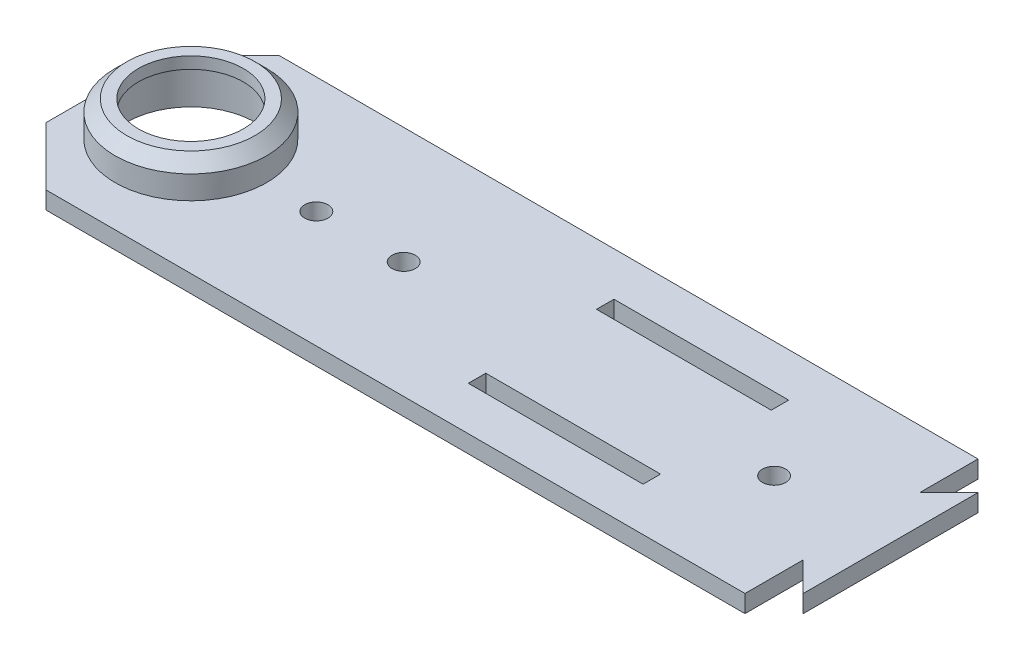
ISO-10303-21;
HEADER;
FILE_DESCRIPTION(('STEP AP214'),'2;1');
FILE_NAME('part.step','',(''),(''),'','','');
FILE_SCHEMA(('AUTOMOTIVE_DESIGN { 1 0 10303 214 1 1 1 1 }'));
ENDSEC;
DATA;
#1=APPLICATION_CONTEXT('core data for automotive mechanical design processes');
#2=APPLICATION_PROTOCOL_DEFINITION('international standard','automotive_design',2000,#1);
#3=PRODUCT_CONTEXT('',#1,'mechanical');
#4=PRODUCT('Part','Part','',(#3));
#5=PRODUCT_RELATED_PRODUCT_CATEGORY('part','',(#4));
#6=PRODUCT_DEFINITION_FORMATION('','',#4);
#7=PRODUCT_DEFINITION_CONTEXT('part definition',#1,'design');
#8=PRODUCT_DEFINITION('design','',#6,#7);
#9=PRODUCT_DEFINITION_SHAPE('','',#8);
#10=(LENGTH_UNIT() NAMED_UNIT(*) SI_UNIT(.MILLI.,.METRE.));
#11=(NAMED_UNIT(*) PLANE_ANGLE_UNIT() SI_UNIT($,.RADIAN.));
#12=(NAMED_UNIT(*) SI_UNIT($,.STERADIAN.) SOLID_ANGLE_UNIT());
#13=UNCERTAINTY_MEASURE_WITH_UNIT(LENGTH_MEASURE(1.E-05),#10,'distance_accuracy_value','');
#14=(GEOMETRIC_REPRESENTATION_CONTEXT(3) GLOBAL_UNCERTAINTY_ASSIGNED_CONTEXT((#13)) GLOBAL_UNIT_ASSIGNED_CONTEXT((#10,
#11,#12)) REPRESENTATION_CONTEXT('',''));
#15=CARTESIAN_POINT('',(0.,0.,0.));
#16=DIRECTION('',(0.,0.,1.));
#17=DIRECTION('',(1.,0.,0.));
#18=AXIS2_PLACEMENT_3D('',#15,#16,#17);
#19=CARTESIAN_POINT('',(0.,3.,0.));
#20=DIRECTION('',(0.,-1.,0.));
#21=DIRECTION('',(0.,0.,-1.));
#22=AXIS2_PLACEMENT_3D('',#19,#20,#21);
#23=PLANE('',#22);
#24=DIRECTION('',(0.,0.,-1.));
#25=VECTOR('',#24,1.);
#26=CARTESIAN_POINT('',(40.,3.,12.5));
#27=LINE('',#26,#25);
#28=CARTESIAN_POINT('',(40.,3.,12.5));
#29=VERTEX_POINT('',#28);
#30=CARTESIAN_POINT('',(40.,3.,9.5));
#31=VERTEX_POINT('',#30);
#32=EDGE_CURVE('E174',#29,#31,#27,.T.);
#33=ORIENTED_EDGE('',*,*,#32,.F.);
#34=DIRECTION('',(1.,0.,0.));
#35=VECTOR('',#34,1.);
#36=CARTESIAN_POINT('',(10.,3.,12.5));
#37=LINE('',#36,#35);
#38=CARTESIAN_POINT('',(10.,3.,12.5));
#39=VERTEX_POINT('',#38);
#40=EDGE_CURVE('E204',#39,#29,#37,.T.);
#41=ORIENTED_EDGE('',*,*,#40,.F.);
#42=DIRECTION('',(0.,0.,1.));
#43=VECTOR('',#42,1.);
#44=CARTESIAN_POINT('',(10.,3.,12.5));
#45=LINE('',#44,#43);
#46=CARTESIAN_POINT('',(10.,3.,9.5));
#47=VERTEX_POINT('',#46);
#48=EDGE_CURVE('E200',#47,#39,#45,.T.);
#49=ORIENTED_EDGE('',*,*,#48,.F.);
#50=DIRECTION('',(-1.,0.,0.));
#51=VECTOR('',#50,1.);
#52=CARTESIAN_POINT('',(10.,3.,9.5));
#53=LINE('',#52,#51);
#54=EDGE_CURVE('E185',#31,#47,#53,.T.);
#55=ORIENTED_EDGE('',*,*,#54,.F.);
#56=EDGE_LOOP('',(#33,#41,#49,#55));
#57=FACE_BOUND('',#56,.T.);
#58=DIRECTION('',(0.,0.,1.));
#59=VECTOR('',#58,1.);
#60=CARTESIAN_POINT('',(-65.,3.,20.));
#61=LINE('',#60,#59);
#62=CARTESIAN_POINT('',(-65.,3.,-9.99999999999997));
#63=VERTEX_POINT('',#62);
#64=CARTESIAN_POINT('',(-65.,3.,9.99999999999999));
#65=VERTEX_POINT('',#64);
#66=EDGE_CURVE('E309',#63,#65,#61,.T.);
#67=ORIENTED_EDGE('',*,*,#66,.T.);
#68=DIRECTION('',(-0.707106781186546,0.,-0.707106781186549));
#69=VECTOR('',#68,1.);
#70=CARTESIAN_POINT('',(-55.,3.,20.));
#71=LINE('',#70,#69);
#72=CARTESIAN_POINT('',(-55.,3.,20.));
#73=VERTEX_POINT('',#72);
#74=EDGE_CURVE('E55',#65,#73,#71,.F.);
#75=ORIENTED_EDGE('',*,*,#74,.T.);
#76=DIRECTION('',(1.,0.,0.));
#77=VECTOR('',#76,1.);
#78=CARTESIAN_POINT('',(-65.,3.,20.));
#79=LINE('',#78,#77);
#80=CARTESIAN_POINT('',(65.,3.,20.));
#81=VERTEX_POINT('',#80);
#82=EDGE_CURVE('E312',#73,#81,#79,.T.);
#83=ORIENTED_EDGE('',*,*,#82,.T.);
#84=DIRECTION('',(0.,0.,-1.));
#85=VECTOR('',#84,1.);
#86=CARTESIAN_POINT('',(65.,3.,20.));
#87=LINE('',#86,#85);
#88=CARTESIAN_POINT('',(65.,3.,10.));
#89=VERTEX_POINT('',#88);
#90=EDGE_CURVE('E315',#81,#89,#87,.T.);
#91=ORIENTED_EDGE('',*,*,#90,.T.);
#92=DIRECTION('',(0.70710678118655,0.,0.707106781186545));
#93=VECTOR('',#92,1.);
#94=CARTESIAN_POINT('',(70.,3.,15.));
#95=LINE('',#94,#93);
#96=CARTESIAN_POINT('',(70.,3.,15.));
#97=VERTEX_POINT('',#96);
#98=EDGE_CURVE('E318',#89,#97,#95,.T.);
#99=ORIENTED_EDGE('',*,*,#98,.T.);
#100=DIRECTION('',(0.,0.,-1.));
#101=VECTOR('',#100,1.);
#102=CARTESIAN_POINT('',(70.,3.,-15.));
#103=LINE('',#102,#101);
#104=CARTESIAN_POINT('',(70.,3.,-15.));
#105=VERTEX_POINT('',#104);
#106=EDGE_CURVE('E321',#97,#105,#103,.T.);
#107=ORIENTED_EDGE('',*,*,#106,.T.);
#108=DIRECTION('',(-0.707106781186549,0.,0.707106781186546));
#109=VECTOR('',#108,1.);
#110=CARTESIAN_POINT('',(65.,3.,-9.99999999999999));
#111=LINE('',#110,#109);
#112=CARTESIAN_POINT('',(65.,3.,-9.99999999999999));
#113=VERTEX_POINT('',#112);
#114=EDGE_CURVE('E324',#105,#113,#111,.T.);
#115=ORIENTED_EDGE('',*,*,#114,.T.);
#116=DIRECTION('',(0.,0.,-1.));
#117=VECTOR('',#116,1.);
#118=CARTESIAN_POINT('',(65.,3.,-9.99999999999999));
#119=LINE('',#118,#117);
#120=CARTESIAN_POINT('',(65.,3.,-20.));
#121=VERTEX_POINT('',#120);
#122=EDGE_CURVE('E301',#113,#121,#119,.T.);
#123=ORIENTED_EDGE('',*,*,#122,.T.);
#124=DIRECTION('',(-1.,0.,0.));
#125=VECTOR('',#124,1.);
#126=CARTESIAN_POINT('',(-65.,3.,-20.));
#127=LINE('',#126,#125);
#128=CARTESIAN_POINT('',(-54.9999999999999,3.,-20.));
#129=VERTEX_POINT('',#128);
#130=EDGE_CURVE('E305',#121,#129,#127,.T.);
#131=ORIENTED_EDGE('',*,*,#130,.T.);
#132=DIRECTION('',(0.707106781186549,0.,-0.707106781186546));
#133=VECTOR('',#132,1.);
#134=CARTESIAN_POINT('',(-65.,3.,-9.99999999999997));
#135=LINE('',#134,#133);
#136=EDGE_CURVE('E402',#129,#63,#135,.F.);
#137=ORIENTED_EDGE('',*,*,#136,.T.);
#138=EDGE_LOOP('',(#67,#75,#83,#91,#99,#107,#115,#123,#131,#137));
#139=FACE_BOUND('',#138,.T.);
#140=DIRECTION('',(0.,0.,-1.));
#141=VECTOR('',#140,1.);
#142=CARTESIAN_POINT('',(40.,3.,-9.5));
#143=LINE('',#142,#141);
#144=CARTESIAN_POINT('',(40.,3.,-9.5));
#145=VERTEX_POINT('',#144);
#146=CARTESIAN_POINT('',(40.,3.,-12.5));
#147=VERTEX_POINT('',#146);
#148=EDGE_CURVE('E254',#145,#147,#143,.T.);
#149=ORIENTED_EDGE('',*,*,#148,.F.);
#150=DIRECTION('',(1.,0.,0.));
#151=VECTOR('',#150,1.);
#152=CARTESIAN_POINT('',(10.,3.,-9.5));
#153=LINE('',#152,#151);
#154=CARTESIAN_POINT('',(10.,3.,-9.5));
#155=VERTEX_POINT('',#154);
#156=EDGE_CURVE('E265',#155,#145,#153,.T.);
#157=ORIENTED_EDGE('',*,*,#156,.F.);
#158=DIRECTION('',(0.,0.,1.));
#159=VECTOR('',#158,1.);
#160=CARTESIAN_POINT('',(10.,3.,-9.5));
#161=LINE('',#160,#159);
#162=CARTESIAN_POINT('',(10.,3.,-12.5));
#163=VERTEX_POINT('',#162);
#164=EDGE_CURVE('E261',#163,#155,#161,.T.);
#165=ORIENTED_EDGE('',*,*,#164,.F.);
#166=DIRECTION('',(-1.,0.,0.));
#167=VECTOR('',#166,1.);
#168=CARTESIAN_POINT('',(10.,3.,-12.5));
#169=LINE('',#168,#167);
#170=EDGE_CURVE('E257',#147,#163,#169,.T.);
#171=ORIENTED_EDGE('',*,*,#170,.F.);
#172=EDGE_LOOP('',(#149,#157,#165,#171));
#173=FACE_BOUND('',#172,.T.);
#174=CARTESIAN_POINT('',(-28.5951279086347,3.,0.));
#175=DIRECTION('',(0.,1.,0.));
#176=DIRECTION('',(0.,0.,1.));
#177=AXIS2_PLACEMENT_3D('',#174,#175,#176);
#178=CIRCLE('',#177,2.);
#179=CARTESIAN_POINT('',(-28.5951279086347,3.,2.));
#180=VERTEX_POINT('',#179);
#181=EDGE_CURVE('E246',#180,#180,#178,.T.);
#182=ORIENTED_EDGE('',*,*,#181,.F.);
#183=EDGE_LOOP('',(#182));
#184=FACE_BOUND('',#183,.T.);
#185=CARTESIAN_POINT('',(-13.5951279086347,3.,0.));
#186=DIRECTION('',(0.,1.,0.));
#187=DIRECTION('',(0.,0.,1.));
#188=AXIS2_PLACEMENT_3D('',#185,#186,#187);
#189=CIRCLE('',#188,2.);
#190=CARTESIAN_POINT('',(-13.5951279086347,3.,2.));
#191=VERTEX_POINT('',#190);
#192=EDGE_CURVE('E238',#191,#191,#189,.T.);
#193=ORIENTED_EDGE('',*,*,#192,.F.);
#194=EDGE_LOOP('',(#193));
#195=FACE_BOUND('',#194,.T.);
#196=CARTESIAN_POINT('',(50.,3.,0.));
#197=DIRECTION('',(0.,1.,0.));
#198=DIRECTION('',(0.,0.,1.));
#199=AXIS2_PLACEMENT_3D('',#196,#197,#198);
#200=CIRCLE('',#199,2.);
#201=CARTESIAN_POINT('',(50.,3.,2.));
#202=VERTEX_POINT('',#201);
#203=EDGE_CURVE('E230',#202,#202,#200,.T.);
#204=ORIENTED_EDGE('',*,*,#203,.F.);
#205=EDGE_LOOP('',(#204));
#206=FACE_BOUND('',#205,.T.);
#207=CARTESIAN_POINT('',(-50.1299429023961,3.,0.));
#208=DIRECTION('',(0.,-1.,0.));
#209=DIRECTION('',(0.,0.,-1.));
#210=AXIS2_PLACEMENT_3D('',#207,#208,#209);
#211=CIRCLE('',#210,13.);
#212=CARTESIAN_POINT('',(-50.1299429023961,3.,-13.));
#213=VERTEX_POINT('',#212);
#214=EDGE_CURVE('E374',#213,#213,#211,.F.);
#215=ORIENTED_EDGE('',*,*,#214,.F.);
#216=EDGE_LOOP('',(#215));
#217=FACE_BOUND('',#216,.T.);
#218=ADVANCED_FACE('F45',(#57,#139,#173,#184,#195,#206,#217),#23,.F.);
#219=CARTESIAN_POINT('',(0.,0.,0.));
#220=DIRECTION('',(0.,-1.,0.));
#221=DIRECTION('',(0.,0.,-1.));
#222=AXIS2_PLACEMENT_3D('',#219,#220,#221);
#223=PLANE('',#222);
#224=CARTESIAN_POINT('',(-13.5951279086347,0.,0.));
#225=DIRECTION('',(0.,1.,0.));
#226=DIRECTION('',(0.,0.,1.));
#227=AXIS2_PLACEMENT_3D('',#224,#225,#226);
#228=CIRCLE('',#227,2.);
#229=CARTESIAN_POINT('',(-13.5951279086347,0.,2.));
#230=VERTEX_POINT('',#229);
#231=EDGE_CURVE('E234',#230,#230,#228,.T.);
#232=ORIENTED_EDGE('',*,*,#231,.T.);
#233=EDGE_LOOP('',(#232));
#234=FACE_BOUND('',#233,.T.);
#235=DIRECTION('',(1.,0.,0.));
#236=VECTOR('',#235,1.);
#237=CARTESIAN_POINT('',(10.,0.,-9.5));
#238=LINE('',#237,#236);
#239=CARTESIAN_POINT('',(10.,0.,-9.5));
#240=VERTEX_POINT('',#239);
#241=CARTESIAN_POINT('',(40.,0.,-9.5));
#242=VERTEX_POINT('',#241);
#243=EDGE_CURVE('E258',#240,#242,#238,.T.);
#244=ORIENTED_EDGE('',*,*,#243,.T.);
#245=DIRECTION('',(0.,0.,-1.));
#246=VECTOR('',#245,1.);
#247=CARTESIAN_POINT('',(40.,0.,-9.5));
#248=LINE('',#247,#246);
#249=CARTESIAN_POINT('',(40.,0.,-12.5));
#250=VERTEX_POINT('',#249);
#251=EDGE_CURVE('E250',#242,#250,#248,.T.);
#252=ORIENTED_EDGE('',*,*,#251,.T.);
#253=DIRECTION('',(-1.,0.,0.));
#254=VECTOR('',#253,1.);
#255=CARTESIAN_POINT('',(10.,0.,-12.5));
#256=LINE('',#255,#254);
#257=CARTESIAN_POINT('',(10.,0.,-12.5));
#258=VERTEX_POINT('',#257);
#259=EDGE_CURVE('E272',#250,#258,#256,.T.);
#260=ORIENTED_EDGE('',*,*,#259,.T.);
#261=DIRECTION('',(0.,0.,1.));
#262=VECTOR('',#261,1.);
#263=CARTESIAN_POINT('',(10.,0.,-9.5));
#264=LINE('',#263,#262);
#265=EDGE_CURVE('E276',#258,#240,#264,.T.);
#266=ORIENTED_EDGE('',*,*,#265,.T.);
#267=EDGE_LOOP('',(#244,#252,#260,#266));
#268=FACE_BOUND('',#267,.T.);
#269=CARTESIAN_POINT('',(-50.1299429023961,0.,0.));
#270=DIRECTION('',(0.,1.,0.));
#271=DIRECTION('',(0.,0.,1.));
#272=AXIS2_PLACEMENT_3D('',#269,#270,#271);
#273=CIRCLE('',#272,11.);
#274=CARTESIAN_POINT('',(-50.1299429023961,0.,11.));
#275=VERTEX_POINT('',#274);
#276=EDGE_CURVE('E296',#275,#275,#273,.T.);
#277=ORIENTED_EDGE('',*,*,#276,.T.);
#278=EDGE_LOOP('',(#277));
#279=FACE_BOUND('',#278,.T.);
#280=DIRECTION('',(1.,0.,0.));
#281=VECTOR('',#280,1.);
#282=CARTESIAN_POINT('',(-65.,0.,20.));
#283=LINE('',#282,#281);
#284=CARTESIAN_POINT('',(-55.,0.,20.));
#285=VERTEX_POINT('',#284);
#286=CARTESIAN_POINT('',(65.,0.,20.));
#287=VERTEX_POINT('',#286);
#288=EDGE_CURVE('E337',#285,#287,#283,.T.);
#289=ORIENTED_EDGE('',*,*,#288,.F.);
#290=DIRECTION('',(0.707106781186546,0.,0.707106781186549));
#291=VECTOR('',#290,1.);
#292=CARTESIAN_POINT('',(-37.5000000000001,0.,37.5));
#293=LINE('',#292,#291);
#294=CARTESIAN_POINT('',(-65.,0.,9.99999999999999));
#295=VERTEX_POINT('',#294);
#296=EDGE_CURVE('E393',#285,#295,#293,.F.);
#297=ORIENTED_EDGE('',*,*,#296,.T.);
#298=DIRECTION('',(0.,0.,1.));
#299=VECTOR('',#298,1.);
#300=CARTESIAN_POINT('',(-65.,0.,20.));
#301=LINE('',#300,#299);
#302=CARTESIAN_POINT('',(-65.,0.,-9.99999999999997));
#303=VERTEX_POINT('',#302);
#304=EDGE_CURVE('E334',#303,#295,#301,.T.);
#305=ORIENTED_EDGE('',*,*,#304,.F.);
#306=DIRECTION('',(-0.707106781186549,0.,0.707106781186546));
#307=VECTOR('',#306,1.);
#308=CARTESIAN_POINT('',(-37.4999999999999,0.,-37.5));
#309=LINE('',#308,#307);
#310=CARTESIAN_POINT('',(-54.9999999999999,0.,-20.));
#311=VERTEX_POINT('',#310);
#312=EDGE_CURVE('E390',#303,#311,#309,.F.);
#313=ORIENTED_EDGE('',*,*,#312,.T.);
#314=DIRECTION('',(-1.,0.,0.));
#315=VECTOR('',#314,1.);
#316=CARTESIAN_POINT('',(-65.,0.,-20.));
#317=LINE('',#316,#315);
#318=CARTESIAN_POINT('',(65.,0.,-20.));
#319=VERTEX_POINT('',#318);
#320=EDGE_CURVE('E331',#319,#311,#317,.T.);
#321=ORIENTED_EDGE('',*,*,#320,.F.);
#322=DIRECTION('',(0.,0.,-1.));
#323=VECTOR('',#322,1.);
#324=CARTESIAN_POINT('',(65.,0.,-9.99999999999999));
#325=LINE('',#324,#323);
#326=CARTESIAN_POINT('',(65.,0.,-9.99999999999999));
#327=VERTEX_POINT('',#326);
#328=EDGE_CURVE('E300',#327,#319,#325,.T.);
#329=ORIENTED_EDGE('',*,*,#328,.F.);
#330=DIRECTION('',(-0.707106781186549,0.,0.707106781186546));
#331=VECTOR('',#330,1.);
#332=CARTESIAN_POINT('',(65.,0.,-9.99999999999999));
#333=LINE('',#332,#331);
#334=CARTESIAN_POINT('',(70.,0.,-15.));
#335=VERTEX_POINT('',#334);
#336=EDGE_CURVE('E306',#335,#327,#333,.T.);
#337=ORIENTED_EDGE('',*,*,#336,.F.);
#338=DIRECTION('',(0.,0.,-1.));
#339=VECTOR('',#338,1.);
#340=CARTESIAN_POINT('',(70.,0.,-15.));
#341=LINE('',#340,#339);
#342=CARTESIAN_POINT('',(70.,0.,15.));
#343=VERTEX_POINT('',#342);
#344=EDGE_CURVE('E346',#343,#335,#341,.T.);
#345=ORIENTED_EDGE('',*,*,#344,.F.);
#346=DIRECTION('',(0.70710678118655,0.,0.707106781186545));
#347=VECTOR('',#346,1.);
#348=CARTESIAN_POINT('',(70.,0.,15.));
#349=LINE('',#348,#347);
#350=CARTESIAN_POINT('',(65.,0.,10.));
#351=VERTEX_POINT('',#350);
#352=EDGE_CURVE('E343',#351,#343,#349,.T.);
#353=ORIENTED_EDGE('',*,*,#352,.F.);
#354=DIRECTION('',(0.,0.,-1.));
#355=VECTOR('',#354,1.);
#356=CARTESIAN_POINT('',(65.,0.,20.));
#357=LINE('',#356,#355);
#358=EDGE_CURVE('E340',#287,#351,#357,.T.);
#359=ORIENTED_EDGE('',*,*,#358,.F.);
#360=EDGE_LOOP('',(#289,#297,#305,#313,#321,#329,#337,#345,#353,#359));
#361=FACE_BOUND('',#360,.T.);
#362=CARTESIAN_POINT('',(-28.5951279086347,0.,0.));
#363=DIRECTION('',(0.,1.,0.));
#364=DIRECTION('',(0.,0.,1.));
#365=AXIS2_PLACEMENT_3D('',#362,#363,#364);
#366=CIRCLE('',#365,2.);
#367=CARTESIAN_POINT('',(-28.5951279086347,0.,2.));
#368=VERTEX_POINT('',#367);
#369=EDGE_CURVE('E242',#368,#368,#366,.T.);
#370=ORIENTED_EDGE('',*,*,#369,.T.);
#371=EDGE_LOOP('',(#370));
#372=FACE_BOUND('',#371,.T.);
#373=CARTESIAN_POINT('',(50.,0.,0.));
#374=DIRECTION('',(0.,1.,0.));
#375=DIRECTION('',(0.,0.,1.));
#376=AXIS2_PLACEMENT_3D('',#373,#374,#375);
#377=CIRCLE('',#376,2.);
#378=CARTESIAN_POINT('',(50.,0.,2.));
#379=VERTEX_POINT('',#378);
#380=EDGE_CURVE('E194',#379,#379,#377,.T.);
#381=ORIENTED_EDGE('',*,*,#380,.T.);
#382=EDGE_LOOP('',(#381));
#383=FACE_BOUND('',#382,.T.);
#384=DIRECTION('',(1.,0.,0.));
#385=VECTOR('',#384,1.);
#386=CARTESIAN_POINT('',(10.,0.,12.5));
#387=LINE('',#386,#385);
#388=CARTESIAN_POINT('',(10.,0.,12.5));
#389=VERTEX_POINT('',#388);
#390=CARTESIAN_POINT('',(40.,0.,12.5));
#391=VERTEX_POINT('',#390);
#392=EDGE_CURVE('E186',#389,#391,#387,.T.);
#393=ORIENTED_EDGE('',*,*,#392,.T.);
#394=DIRECTION('',(0.,0.,-1.));
#395=VECTOR('',#394,1.);
#396=CARTESIAN_POINT('',(40.,0.,12.5));
#397=LINE('',#396,#395);
#398=CARTESIAN_POINT('',(40.,0.,9.5));
#399=VERTEX_POINT('',#398);
#400=EDGE_CURVE('E210',#391,#399,#397,.T.);
#401=ORIENTED_EDGE('',*,*,#400,.T.);
#402=DIRECTION('',(-1.,0.,0.));
#403=VECTOR('',#402,1.);
#404=CARTESIAN_POINT('',(10.,0.,9.5));
#405=LINE('',#404,#403);
#406=CARTESIAN_POINT('',(10.,0.,9.5));
#407=VERTEX_POINT('',#406);
#408=EDGE_CURVE('E192',#399,#407,#405,.T.);
#409=ORIENTED_EDGE('',*,*,#408,.T.);
#410=DIRECTION('',(0.,0.,1.));
#411=VECTOR('',#410,1.);
#412=CARTESIAN_POINT('',(10.,0.,12.5));
#413=LINE('',#412,#411);
#414=EDGE_CURVE('E216',#407,#389,#413,.T.);
#415=ORIENTED_EDGE('',*,*,#414,.T.);
#416=EDGE_LOOP('',(#393,#401,#409,#415));
#417=FACE_BOUND('',#416,.T.);
#418=ADVANCED_FACE('F418',(#234,#268,#279,#361,#372,#383,#417),#223,.T.);
#419=CARTESIAN_POINT('',(65.,3.,-9.99999999999999));
#420=DIRECTION('',(-1.,0.,0.));
#421=DIRECTION('',(0.,0.,1.));
#422=AXIS2_PLACEMENT_3D('',#419,#420,#421);
#423=PLANE('',#422);
#424=ORIENTED_EDGE('',*,*,#328,.T.);
#425=DIRECTION('',(0.,-1.,0.));
#426=VECTOR('',#425,1.);
#427=CARTESIAN_POINT('',(65.,3.,-20.));
#428=LINE('',#427,#426);
#429=EDGE_CURVE('E370',#121,#319,#428,.T.);
#430=ORIENTED_EDGE('',*,*,#429,.F.);
#431=ORIENTED_EDGE('',*,*,#122,.F.);
#432=DIRECTION('',(0.,-1.,0.));
#433=VECTOR('',#432,1.);
#434=CARTESIAN_POINT('',(65.,3.,-9.99999999999999));
#435=LINE('',#434,#433);
#436=EDGE_CURVE('E327',#113,#327,#435,.T.);
#437=ORIENTED_EDGE('',*,*,#436,.T.);
#438=EDGE_LOOP('',(#424,#430,#431,#437));
#439=FACE_BOUND('',#438,.T.);
#440=ADVANCED_FACE('F430',(#439),#423,.F.);
#441=CARTESIAN_POINT('',(-65.,3.,-20.));
#442=DIRECTION('',(0.,0.,1.));
#443=DIRECTION('',(1.,0.,0.));
#444=AXIS2_PLACEMENT_3D('',#441,#442,#443);
#445=PLANE('',#444);
#446=ORIENTED_EDGE('',*,*,#320,.T.);
#447=DIRECTION('',(0.,1.,0.));
#448=VECTOR('',#447,1.);
#449=CARTESIAN_POINT('',(-54.9999999999999,3.,-20.));
#450=LINE('',#449,#448);
#451=EDGE_CURVE('E11',#311,#129,#450,.T.);
#452=ORIENTED_EDGE('',*,*,#451,.T.);
#453=ORIENTED_EDGE('',*,*,#130,.F.);
#454=ORIENTED_EDGE('',*,*,#429,.T.);
#455=EDGE_LOOP('',(#446,#452,#453,#454));
#456=FACE_BOUND('',#455,.T.);
#457=ADVANCED_FACE('F426',(#456),#445,.F.);
#458=CARTESIAN_POINT('',(-65.,3.,20.));
#459=DIRECTION('',(1.,0.,0.));
#460=DIRECTION('',(0.,0.,-1.));
#461=AXIS2_PLACEMENT_3D('',#458,#459,#460);
#462=PLANE('',#461);
#463=ORIENTED_EDGE('',*,*,#304,.T.);
#464=DIRECTION('',(0.,1.,0.));
#465=VECTOR('',#464,1.);
#466=CARTESIAN_POINT('',(-65.,3.,9.99999999999999));
#467=LINE('',#466,#465);
#468=EDGE_CURVE('E68',#295,#65,#467,.T.);
#469=ORIENTED_EDGE('',*,*,#468,.T.);
#470=ORIENTED_EDGE('',*,*,#66,.F.);
#471=DIRECTION('',(0.,-1.,0.));
#472=VECTOR('',#471,1.);
#473=CARTESIAN_POINT('',(-65.,3.,-9.99999999999997));
#474=LINE('',#473,#472);
#475=EDGE_CURVE('E396',#63,#303,#474,.T.);
#476=ORIENTED_EDGE('',*,*,#475,.T.);
#477=EDGE_LOOP('',(#463,#469,#470,#476));
#478=FACE_BOUND('',#477,.T.);
#479=ADVANCED_FACE('F421',(#478),#462,.F.);
#480=CARTESIAN_POINT('',(-65.,3.,20.));
#481=DIRECTION('',(0.,0.,-1.));
#482=DIRECTION('',(-1.,0.,0.));
#483=AXIS2_PLACEMENT_3D('',#480,#481,#482);
#484=PLANE('',#483);
#485=ORIENTED_EDGE('',*,*,#82,.F.);
#486=DIRECTION('',(0.,-1.,0.));
#487=VECTOR('',#486,1.);
#488=CARTESIAN_POINT('',(-55.,3.,20.));
#489=LINE('',#488,#487);
#490=EDGE_CURVE('E386',#73,#285,#489,.T.);
#491=ORIENTED_EDGE('',*,*,#490,.T.);
#492=ORIENTED_EDGE('',*,*,#288,.T.);
#493=DIRECTION('',(0.,-1.,0.));
#494=VECTOR('',#493,1.);
#495=CARTESIAN_POINT('',(65.,3.,20.));
#496=LINE('',#495,#494);
#497=EDGE_CURVE('E366',#81,#287,#496,.T.);
#498=ORIENTED_EDGE('',*,*,#497,.F.);
#499=EDGE_LOOP('',(#485,#491,#492,#498));
#500=FACE_BOUND('',#499,.T.);
#501=ADVANCED_FACE('F412',(#500),#484,.F.);
#502=CARTESIAN_POINT('',(65.,3.,20.));
#503=DIRECTION('',(-1.,0.,0.));
#504=DIRECTION('',(0.,0.,1.));
#505=AXIS2_PLACEMENT_3D('',#502,#503,#504);
#506=PLANE('',#505);
#507=ORIENTED_EDGE('',*,*,#358,.T.);
#508=DIRECTION('',(0.,-1.,0.));
#509=VECTOR('',#508,1.);
#510=CARTESIAN_POINT('',(65.,3.,10.));
#511=LINE('',#510,#509);
#512=EDGE_CURVE('E362',#89,#351,#511,.T.);
#513=ORIENTED_EDGE('',*,*,#512,.F.);
#514=ORIENTED_EDGE('',*,*,#90,.F.);
#515=ORIENTED_EDGE('',*,*,#497,.T.);
#516=EDGE_LOOP('',(#507,#513,#514,#515));
#517=FACE_BOUND('',#516,.T.);
#518=ADVANCED_FACE('F448',(#517),#506,.F.);
#519=CARTESIAN_POINT('',(70.,3.,15.));
#520=DIRECTION('',(0.707106781186545,0.,-0.70710678118655));
#521=DIRECTION('',(-0.70710678118655,0.,-0.707106781186545));
#522=AXIS2_PLACEMENT_3D('',#519,#520,#521);
#523=PLANE('',#522);
#524=ORIENTED_EDGE('',*,*,#352,.T.);
#525=DIRECTION('',(0.,-1.,0.));
#526=VECTOR('',#525,1.);
#527=CARTESIAN_POINT('',(70.,3.,15.));
#528=LINE('',#527,#526);
#529=EDGE_CURVE('E358',#97,#343,#528,.T.);
#530=ORIENTED_EDGE('',*,*,#529,.F.);
#531=ORIENTED_EDGE('',*,*,#98,.F.);
#532=ORIENTED_EDGE('',*,*,#512,.T.);
#533=EDGE_LOOP('',(#524,#530,#531,#532));
#534=FACE_BOUND('',#533,.T.);
#535=ADVANCED_FACE('F445',(#534),#523,.F.);
#536=CARTESIAN_POINT('',(70.,3.,-15.));
#537=DIRECTION('',(-1.,0.,0.));
#538=DIRECTION('',(0.,0.,1.));
#539=AXIS2_PLACEMENT_3D('',#536,#537,#538);
#540=PLANE('',#539);
#541=ORIENTED_EDGE('',*,*,#344,.T.);
#542=DIRECTION('',(0.,-1.,0.));
#543=VECTOR('',#542,1.);
#544=CARTESIAN_POINT('',(70.,3.,-15.));
#545=LINE('',#544,#543);
#546=EDGE_CURVE('E354',#105,#335,#545,.T.);
#547=ORIENTED_EDGE('',*,*,#546,.F.);
#548=ORIENTED_EDGE('',*,*,#106,.F.);
#549=ORIENTED_EDGE('',*,*,#529,.T.);
#550=EDGE_LOOP('',(#541,#547,#548,#549));
#551=FACE_BOUND('',#550,.T.);
#552=ADVANCED_FACE('F441',(#551),#540,.F.);
#553=CARTESIAN_POINT('',(65.,3.,-9.99999999999999));
#554=DIRECTION('',(0.707106781186546,0.,0.707106781186549));
#555=DIRECTION('',(0.707106781186549,0.,-0.707106781186546));
#556=AXIS2_PLACEMENT_3D('',#553,#554,#555);
#557=PLANE('',#556);
#558=ORIENTED_EDGE('',*,*,#336,.T.);
#559=ORIENTED_EDGE('',*,*,#436,.F.);
#560=ORIENTED_EDGE('',*,*,#114,.F.);
#561=ORIENTED_EDGE('',*,*,#546,.T.);
#562=EDGE_LOOP('',(#558,#559,#560,#561));
#563=FACE_BOUND('',#562,.T.);
#564=ADVANCED_FACE('F436',(#563),#557,.F.);
#565=CARTESIAN_POINT('',(-50.1299429023961,3.,0.));
#566=DIRECTION('',(0.,-1.,0.));
#567=DIRECTION('',(0.,0.,-1.));
#568=AXIS2_PLACEMENT_3D('',#565,#566,#567);
#569=CYLINDRICAL_SURFACE('',#568,11.);
#570=ORIENTED_EDGE('',*,*,#276,.F.);
#571=EDGE_LOOP('',(#570));
#572=FACE_BOUND('',#571,.T.);
#573=CARTESIAN_POINT('',(-50.1299429023961,7.,0.));
#574=DIRECTION('',(0.,1.,0.));
#575=DIRECTION('',(0.,0.,1.));
#576=AXIS2_PLACEMENT_3D('',#573,#574,#575);
#577=CIRCLE('',#576,11.);
#578=CARTESIAN_POINT('',(-50.1299429023961,7.,11.));
#579=VERTEX_POINT('',#578);
#580=EDGE_CURVE('E213',#579,#579,#577,.T.);
#581=ORIENTED_EDGE('',*,*,#580,.T.);
#582=EDGE_LOOP('',(#581));
#583=FACE_BOUND('',#582,.T.);
#584=ADVANCED_FACE('F465',(#572,#583),#569,.F.);
#585=CARTESIAN_POINT('',(40.,3.,-9.5));
#586=DIRECTION('',(-1.,0.,0.));
#587=DIRECTION('',(0.,0.,1.));
#588=AXIS2_PLACEMENT_3D('',#585,#586,#587);
#589=PLANE('',#588);
#590=ORIENTED_EDGE('',*,*,#251,.F.);
#591=DIRECTION('',(0.,-1.,0.));
#592=VECTOR('',#591,1.);
#593=CARTESIAN_POINT('',(40.,3.,-9.5));
#594=LINE('',#593,#592);
#595=EDGE_CURVE('E268',#145,#242,#594,.T.);
#596=ORIENTED_EDGE('',*,*,#595,.F.);
#597=ORIENTED_EDGE('',*,*,#148,.T.);
#598=DIRECTION('',(0.,-1.,0.));
#599=VECTOR('',#598,1.);
#600=CARTESIAN_POINT('',(40.,3.,-12.5));
#601=LINE('',#600,#599);
#602=EDGE_CURVE('E292',#147,#250,#601,.T.);
#603=ORIENTED_EDGE('',*,*,#602,.T.);
#604=EDGE_LOOP('',(#590,#596,#597,#603));
#605=FACE_BOUND('',#604,.T.);
#606=ADVANCED_FACE('F486',(#605),#589,.T.);
#607=CARTESIAN_POINT('',(10.,3.,-12.5));
#608=DIRECTION('',(0.,0.,1.));
#609=DIRECTION('',(1.,0.,0.));
#610=AXIS2_PLACEMENT_3D('',#607,#608,#609);
#611=PLANE('',#610);
#612=ORIENTED_EDGE('',*,*,#259,.F.);
#613=ORIENTED_EDGE('',*,*,#602,.F.);
#614=ORIENTED_EDGE('',*,*,#170,.T.);
#615=DIRECTION('',(0.,-1.,0.));
#616=VECTOR('',#615,1.);
#617=CARTESIAN_POINT('',(10.,3.,-12.5));
#618=LINE('',#617,#616);
#619=EDGE_CURVE('E289',#163,#258,#618,.T.);
#620=ORIENTED_EDGE('',*,*,#619,.T.);
#621=EDGE_LOOP('',(#612,#613,#614,#620));
#622=FACE_BOUND('',#621,.T.);
#623=ADVANCED_FACE('F494',(#622),#611,.T.);
#624=CARTESIAN_POINT('',(10.,3.,-9.5));
#625=DIRECTION('',(1.,0.,0.));
#626=DIRECTION('',(0.,0.,-1.));
#627=AXIS2_PLACEMENT_3D('',#624,#625,#626);
#628=PLANE('',#627);
#629=ORIENTED_EDGE('',*,*,#265,.F.);
#630=ORIENTED_EDGE('',*,*,#619,.F.);
#631=ORIENTED_EDGE('',*,*,#164,.T.);
#632=DIRECTION('',(0.,-1.,0.));
#633=VECTOR('',#632,1.);
#634=CARTESIAN_POINT('',(10.,3.,-9.5));
#635=LINE('',#634,#633);
#636=EDGE_CURVE('E286',#155,#240,#635,.T.);
#637=ORIENTED_EDGE('',*,*,#636,.T.);
#638=EDGE_LOOP('',(#629,#630,#631,#637));
#639=FACE_BOUND('',#638,.T.);
#640=ADVANCED_FACE('F501',(#639),#628,.T.);
#641=CARTESIAN_POINT('',(10.,3.,-9.5));
#642=DIRECTION('',(0.,0.,-1.));
#643=DIRECTION('',(-1.,0.,0.));
#644=AXIS2_PLACEMENT_3D('',#641,#642,#643);
#645=PLANE('',#644);
#646=ORIENTED_EDGE('',*,*,#243,.F.);
#647=ORIENTED_EDGE('',*,*,#636,.F.);
#648=ORIENTED_EDGE('',*,*,#156,.T.);
#649=ORIENTED_EDGE('',*,*,#595,.T.);
#650=EDGE_LOOP('',(#646,#647,#648,#649));
#651=FACE_BOUND('',#650,.T.);
#652=ADVANCED_FACE('F509',(#651),#645,.T.);
#653=CARTESIAN_POINT('',(-28.5951279086347,3.,0.));
#654=DIRECTION('',(0.,-1.,0.));
#655=DIRECTION('',(0.,0.,-1.));
#656=AXIS2_PLACEMENT_3D('',#653,#654,#655);
#657=CYLINDRICAL_SURFACE('',#656,2.);
#658=ORIENTED_EDGE('',*,*,#181,.T.);
#659=EDGE_LOOP('',(#658));
#660=FACE_BOUND('',#659,.T.);
#661=ORIENTED_EDGE('',*,*,#369,.F.);
#662=EDGE_LOOP('',(#661));
#663=FACE_BOUND('',#662,.T.);
#664=ADVANCED_FACE('F517',(#660,#663),#657,.F.);
#665=CARTESIAN_POINT('',(-13.5951279086347,3.,0.));
#666=DIRECTION('',(0.,-1.,0.));
#667=DIRECTION('',(0.,0.,-1.));
#668=AXIS2_PLACEMENT_3D('',#665,#666,#667);
#669=CYLINDRICAL_SURFACE('',#668,2.);
#670=ORIENTED_EDGE('',*,*,#192,.T.);
#671=EDGE_LOOP('',(#670));
#672=FACE_BOUND('',#671,.T.);
#673=ORIENTED_EDGE('',*,*,#231,.F.);
#674=EDGE_LOOP('',(#673));
#675=FACE_BOUND('',#674,.T.);
#676=ADVANCED_FACE('F525',(#672,#675),#669,.F.);
#677=CARTESIAN_POINT('',(50.,3.,0.));
#678=DIRECTION('',(0.,-1.,0.));
#679=DIRECTION('',(0.,0.,-1.));
#680=AXIS2_PLACEMENT_3D('',#677,#678,#679);
#681=CYLINDRICAL_SURFACE('',#680,2.);
#682=ORIENTED_EDGE('',*,*,#203,.T.);
#683=EDGE_LOOP('',(#682));
#684=FACE_BOUND('',#683,.T.);
#685=ORIENTED_EDGE('',*,*,#380,.F.);
#686=EDGE_LOOP('',(#685));
#687=FACE_BOUND('',#686,.T.);
#688=ADVANCED_FACE('F533',(#684,#687),#681,.F.);
#689=CARTESIAN_POINT('',(40.,3.,12.5));
#690=DIRECTION('',(-1.,0.,0.));
#691=DIRECTION('',(0.,0.,1.));
#692=AXIS2_PLACEMENT_3D('',#689,#690,#691);
#693=PLANE('',#692);
#694=ORIENTED_EDGE('',*,*,#400,.F.);
#695=DIRECTION('',(0.,-1.,0.));
#696=VECTOR('',#695,1.);
#697=CARTESIAN_POINT('',(40.,3.,12.5));
#698=LINE('',#697,#696);
#699=EDGE_CURVE('E180',#29,#391,#698,.T.);
#700=ORIENTED_EDGE('',*,*,#699,.F.);
#701=ORIENTED_EDGE('',*,*,#32,.T.);
#702=DIRECTION('',(0.,-1.,0.));
#703=VECTOR('',#702,1.);
#704=CARTESIAN_POINT('',(40.,3.,9.5));
#705=LINE('',#704,#703);
#706=EDGE_CURVE('E177',#31,#399,#705,.T.);
#707=ORIENTED_EDGE('',*,*,#706,.T.);
#708=EDGE_LOOP('',(#694,#700,#701,#707));
#709=FACE_BOUND('',#708,.T.);
#710=ADVANCED_FACE('F176',(#709),#693,.T.);
#711=CARTESIAN_POINT('',(10.,3.,9.5));
#712=DIRECTION('',(0.,0.,1.));
#713=DIRECTION('',(1.,0.,0.));
#714=AXIS2_PLACEMENT_3D('',#711,#712,#713);
#715=PLANE('',#714);
#716=ORIENTED_EDGE('',*,*,#408,.F.);
#717=ORIENTED_EDGE('',*,*,#706,.F.);
#718=ORIENTED_EDGE('',*,*,#54,.T.);
#719=DIRECTION('',(0.,-1.,0.));
#720=VECTOR('',#719,1.);
#721=CARTESIAN_POINT('',(10.,3.,9.5));
#722=LINE('',#721,#720);
#723=EDGE_CURVE('E195',#47,#407,#722,.T.);
#724=ORIENTED_EDGE('',*,*,#723,.T.);
#725=EDGE_LOOP('',(#716,#717,#718,#724));
#726=FACE_BOUND('',#725,.T.);
#727=ADVANCED_FACE('F189',(#726),#715,.T.);
#728=CARTESIAN_POINT('',(10.,3.,12.5));
#729=DIRECTION('',(1.,0.,0.));
#730=DIRECTION('',(0.,0.,-1.));
#731=AXIS2_PLACEMENT_3D('',#728,#729,#730);
#732=PLANE('',#731);
#733=ORIENTED_EDGE('',*,*,#414,.F.);
#734=ORIENTED_EDGE('',*,*,#723,.F.);
#735=ORIENTED_EDGE('',*,*,#48,.T.);
#736=DIRECTION('',(0.,-1.,0.));
#737=VECTOR('',#736,1.);
#738=CARTESIAN_POINT('',(10.,3.,12.5));
#739=LINE('',#738,#737);
#740=EDGE_CURVE('E225',#39,#389,#739,.T.);
#741=ORIENTED_EDGE('',*,*,#740,.T.);
#742=EDGE_LOOP('',(#733,#734,#735,#741));
#743=FACE_BOUND('',#742,.T.);
#744=ADVANCED_FACE('F554',(#743),#732,.T.);
#745=CARTESIAN_POINT('',(10.,3.,12.5));
#746=DIRECTION('',(0.,0.,-1.));
#747=DIRECTION('',(-1.,0.,0.));
#748=AXIS2_PLACEMENT_3D('',#745,#746,#747);
#749=PLANE('',#748);
#750=ORIENTED_EDGE('',*,*,#392,.F.);
#751=ORIENTED_EDGE('',*,*,#740,.F.);
#752=ORIENTED_EDGE('',*,*,#40,.T.);
#753=ORIENTED_EDGE('',*,*,#699,.T.);
#754=EDGE_LOOP('',(#750,#751,#752,#753));
#755=FACE_BOUND('',#754,.T.);
#756=ADVANCED_FACE('F561',(#755),#749,.T.);
#757=CARTESIAN_POINT('',(-50.1299429023961,7.,0.));
#758=DIRECTION('',(0.,-1.,0.));
#759=DIRECTION('',(0.,0.,-1.));
#760=AXIS2_PLACEMENT_3D('',#757,#758,#759);
#761=CYLINDRICAL_SURFACE('',#760,13.);
#762=CARTESIAN_POINT('',(-50.1299429023961,6.99999999999999,0.));
#763=DIRECTION('',(0.,1.,0.));
#764=DIRECTION('',(0.,0.,1.));
#765=AXIS2_PLACEMENT_3D('',#762,#763,#764);
#766=CIRCLE('',#765,13.);
#767=CARTESIAN_POINT('',(-50.1299429023961,6.99999999999999,13.));
#768=VERTEX_POINT('',#767);
#769=EDGE_CURVE('E382',#768,#768,#766,.F.);
#770=ORIENTED_EDGE('',*,*,#769,.T.);
#771=EDGE_LOOP('',(#770));
#772=FACE_BOUND('',#771,.T.);
#773=ORIENTED_EDGE('',*,*,#214,.T.);
#774=EDGE_LOOP('',(#773));
#775=FACE_BOUND('',#774,.T.);
#776=ADVANCED_FACE('F568',(#772,#775),#761,.T.);
#777=CARTESIAN_POINT('',(-50.1299429023961,7.,0.));
#778=DIRECTION('',(0.,1.,0.));
#779=DIRECTION('',(0.,0.,1.));
#780=AXIS2_PLACEMENT_3D('',#777,#778,#779);
#781=PLANE('',#780);
#782=CARTESIAN_POINT('',(-50.1299429023961,7.,0.));
#783=DIRECTION('',(0.,1.,0.));
#784=DIRECTION('',(0.,0.,1.));
#785=AXIS2_PLACEMENT_3D('',#782,#783,#784);
#786=CIRCLE('',#785,9.);
#787=CARTESIAN_POINT('',(-50.1299429023961,7.,9.));
#788=VERTEX_POINT('',#787);
#789=EDGE_CURVE('E790',#788,#788,#786,.T.);
#790=ORIENTED_EDGE('',*,*,#789,.T.);
#791=EDGE_LOOP('',(#790));
#792=FACE_BOUND('',#791,.T.);
#793=ORIENTED_EDGE('',*,*,#580,.F.);
#794=EDGE_LOOP('',(#793));
#795=FACE_BOUND('',#794,.T.);
#796=ADVANCED_FACE('F576',(#792,#795),#781,.F.);
#797=CARTESIAN_POINT('',(-50.1299429023961,9.,0.));
#798=DIRECTION('',(0.,1.,0.));
#799=DIRECTION('',(0.,0.,1.));
#800=AXIS2_PLACEMENT_3D('',#797,#798,#799);
#801=PLANE('',#800);
#802=CARTESIAN_POINT('',(-50.1299429023961,9.,0.));
#803=DIRECTION('',(0.,1.,0.));
#804=DIRECTION('',(0.,0.,1.));
#805=AXIS2_PLACEMENT_3D('',#802,#803,#804);
#806=CIRCLE('',#805,11.);
#807=CARTESIAN_POINT('',(-50.1299429023961,9.,11.));
#808=VERTEX_POINT('',#807);
#809=EDGE_CURVE('E378',#808,#808,#806,.T.);
#810=ORIENTED_EDGE('',*,*,#809,.T.);
#811=EDGE_LOOP('',(#810));
#812=FACE_BOUND('',#811,.T.);
#813=CARTESIAN_POINT('',(-50.1299429023961,9.,0.));
#814=DIRECTION('',(0.,1.,0.));
#815=DIRECTION('',(0.,0.,1.));
#816=AXIS2_PLACEMENT_3D('',#813,#814,#815);
#817=CIRCLE('',#816,9.);
#818=CARTESIAN_POINT('',(-50.1299429023961,9.,9.));
#819=VERTEX_POINT('',#818);
#820=EDGE_CURVE('E788',#819,#819,#817,.T.);
#821=ORIENTED_EDGE('',*,*,#820,.F.);
#822=EDGE_LOOP('',(#821));
#823=FACE_BOUND('',#822,.T.);
#824=ADVANCED_FACE('F585',(#812,#823),#801,.T.);
#825=CARTESIAN_POINT('',(-50.1299429023961,9.,0.));
#826=DIRECTION('',(0.,-1.,0.));
#827=DIRECTION('',(0.,0.,-1.));
#828=AXIS2_PLACEMENT_3D('',#825,#826,#827);
#829=CYLINDRICAL_SURFACE('',#828,9.);
#830=ORIENTED_EDGE('',*,*,#820,.T.);
#831=EDGE_LOOP('',(#830));
#832=FACE_BOUND('',#831,.T.);
#833=ORIENTED_EDGE('',*,*,#789,.F.);
#834=EDGE_LOOP('',(#833));
#835=FACE_BOUND('',#834,.T.);
#836=ADVANCED_FACE('F592',(#832,#835),#829,.F.);
#837=CARTESIAN_POINT('',(-50.1299429023961,9.,0.));
#838=DIRECTION('',(0.,-1.,0.));
#839=DIRECTION('',(0.,0.,-1.));
#840=AXIS2_PLACEMENT_3D('',#837,#838,#839);
#841=CONICAL_SURFACE('',#840,11.,0.785398163397447);
#842=ORIENTED_EDGE('',*,*,#769,.F.);
#843=EDGE_LOOP('',(#842));
#844=FACE_BOUND('',#843,.T.);
#845=ORIENTED_EDGE('',*,*,#809,.F.);
#846=EDGE_LOOP('',(#845));
#847=FACE_BOUND('',#846,.T.);
#848=ADVANCED_FACE('F600',(#844,#847),#841,.T.);
#849=CARTESIAN_POINT('',(-55.,3.,20.));
#850=DIRECTION('',(0.707106781186549,0.,-0.707106781186546));
#851=DIRECTION('',(0.,-1.,0.));
#852=AXIS2_PLACEMENT_3D('',#849,#850,#851);
#853=PLANE('',#852);
#854=ORIENTED_EDGE('',*,*,#74,.F.);
#855=ORIENTED_EDGE('',*,*,#468,.F.);
#856=ORIENTED_EDGE('',*,*,#296,.F.);
#857=ORIENTED_EDGE('',*,*,#490,.F.);
#858=EDGE_LOOP('',(#854,#855,#856,#857));
#859=FACE_BOUND('',#858,.T.);
#860=ADVANCED_FACE('F415',(#859),#853,.F.);
#861=CARTESIAN_POINT('',(-65.,3.,-9.99999999999997));
#862=DIRECTION('',(0.707106781186546,0.,0.707106781186549));
#863=DIRECTION('',(0.,-1.,0.));
#864=AXIS2_PLACEMENT_3D('',#861,#862,#863);
#865=PLANE('',#864);
#866=ORIENTED_EDGE('',*,*,#136,.F.);
#867=ORIENTED_EDGE('',*,*,#451,.F.);
#868=ORIENTED_EDGE('',*,*,#312,.F.);
#869=ORIENTED_EDGE('',*,*,#475,.F.);
#870=EDGE_LOOP('',(#866,#867,#868,#869));
#871=FACE_BOUND('',#870,.T.);
#872=ADVANCED_FACE('F48',(#871),#865,.F.);
#873=CLOSED_SHELL('',(#218,#418,#440,#457,#479,#501,#518,#535,#552,#564,#584,#606,#623,#640,
#652,#664,#676,#688,#710,#727,#744,#756,#776,#796,#824,#836,#848,#860,#872));
#874=MANIFOLD_SOLID_BREP('B2',#873);
#875=ADVANCED_BREP_SHAPE_REPRESENTATION('',(#18,#874),#14);
#876=SHAPE_DEFINITION_REPRESENTATION(#9,#875);
ENDSEC;
END-ISO-10303-21;
